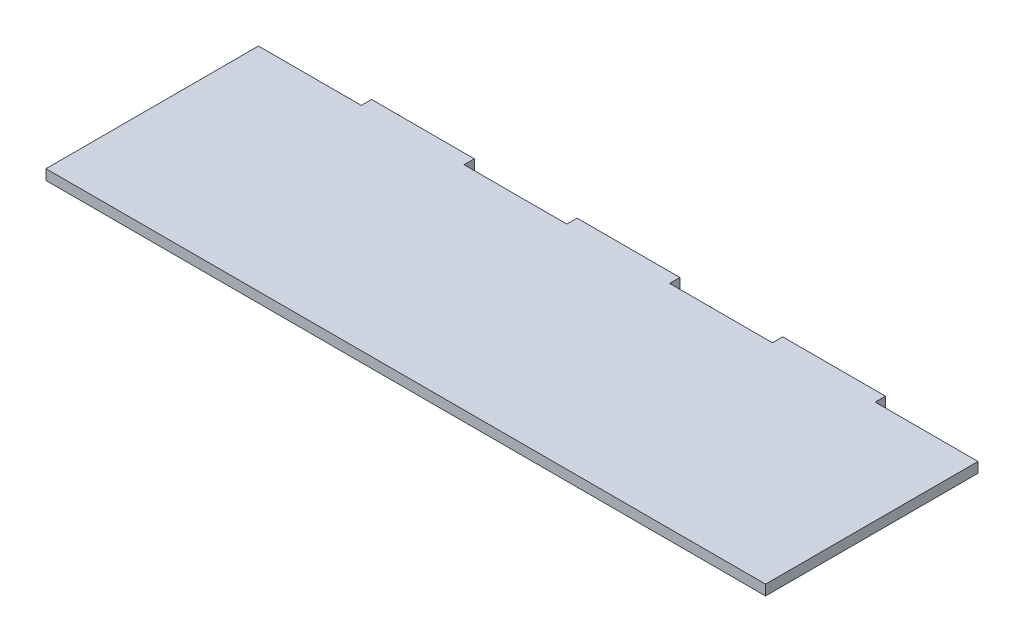
ISO-10303-21;
HEADER;
FILE_DESCRIPTION(('STEP AP214'),'2;1');
FILE_NAME('part.step','',(''),(''),'','','');
FILE_SCHEMA(('AUTOMOTIVE_DESIGN { 1 0 10303 214 1 1 1 1 }'));
ENDSEC;
DATA;
#1=APPLICATION_CONTEXT('core data for automotive mechanical design processes');
#2=APPLICATION_PROTOCOL_DEFINITION('international standard','automotive_design',2000,#1);
#3=PRODUCT_CONTEXT('',#1,'mechanical');
#4=PRODUCT('Part','Part','',(#3));
#5=PRODUCT_RELATED_PRODUCT_CATEGORY('part','',(#4));
#6=PRODUCT_DEFINITION_FORMATION('','',#4);
#7=PRODUCT_DEFINITION_CONTEXT('part definition',#1,'design');
#8=PRODUCT_DEFINITION('design','',#6,#7);
#9=PRODUCT_DEFINITION_SHAPE('','',#8);
#10=(LENGTH_UNIT() NAMED_UNIT(*) SI_UNIT(.MILLI.,.METRE.));
#11=(NAMED_UNIT(*) PLANE_ANGLE_UNIT() SI_UNIT($,.RADIAN.));
#12=(NAMED_UNIT(*) SI_UNIT($,.STERADIAN.) SOLID_ANGLE_UNIT());
#13=UNCERTAINTY_MEASURE_WITH_UNIT(LENGTH_MEASURE(1.E-05),#10,'distance_accuracy_value','');
#14=(GEOMETRIC_REPRESENTATION_CONTEXT(3) GLOBAL_UNCERTAINTY_ASSIGNED_CONTEXT((#13)) GLOBAL_UNIT_ASSIGNED_CONTEXT((#10,
#11,#12)) REPRESENTATION_CONTEXT('',''));
#15=CARTESIAN_POINT('',(0.,0.,0.));
#16=DIRECTION('',(0.,0.,1.));
#17=DIRECTION('',(1.,0.,0.));
#18=AXIS2_PLACEMENT_3D('',#15,#16,#17);
#19=CARTESIAN_POINT('',(0.,3.,-65.));
#20=DIRECTION('',(0.,0.,1.));
#21=DIRECTION('',(1.,0.,0.));
#22=AXIS2_PLACEMENT_3D('',#19,#20,#21);
#23=PLANE('',#22);
#24=DIRECTION('',(-1.,0.,0.));
#25=VECTOR('',#24,1.);
#26=CARTESIAN_POINT('',(0.,0.,-65.));
#27=LINE('',#26,#25);
#28=CARTESIAN_POINT('',(120.,0.,-65.));
#29=VERTEX_POINT('',#28);
#30=CARTESIAN_POINT('',(90.,0.,-65.));
#31=VERTEX_POINT('',#30);
#32=EDGE_CURVE('E170',#29,#31,#27,.T.);
#33=ORIENTED_EDGE('',*,*,#32,.T.);
#34=DIRECTION('',(0.,1.,0.));
#35=VECTOR('',#34,1.);
#36=CARTESIAN_POINT('',(90.,-2.,-65.));
#37=LINE('',#36,#35);
#38=CARTESIAN_POINT('',(90.,3.,-65.));
#39=VERTEX_POINT('',#38);
#40=EDGE_CURVE('E159',#31,#39,#37,.T.);
#41=ORIENTED_EDGE('',*,*,#40,.T.);
#42=DIRECTION('',(-1.,0.,0.));
#43=VECTOR('',#42,1.);
#44=CARTESIAN_POINT('',(0.,3.,-65.));
#45=LINE('',#44,#43);
#46=CARTESIAN_POINT('',(120.,3.,-65.));
#47=VERTEX_POINT('',#46);
#48=EDGE_CURVE('E181',#47,#39,#45,.T.);
#49=ORIENTED_EDGE('',*,*,#48,.F.);
#50=DIRECTION('',(0.,1.,0.));
#51=VECTOR('',#50,1.);
#52=CARTESIAN_POINT('',(120.,-2.,-65.));
#53=LINE('',#52,#51);
#54=EDGE_CURVE('E256',#29,#47,#53,.T.);
#55=ORIENTED_EDGE('',*,*,#54,.F.);
#56=EDGE_LOOP('',(#33,#41,#49,#55));
#57=FACE_BOUND('',#56,.T.);
#58=ADVANCED_FACE('F33',(#57),#23,.F.);
#59=CARTESIAN_POINT('',(180.,0.,-65.));
#60=VERTEX_POINT('',#59);
#61=CARTESIAN_POINT('',(150.,0.,-65.));
#62=VERTEX_POINT('',#61);
#63=EDGE_CURVE('E165',#60,#62,#27,.T.);
#64=ORIENTED_EDGE('',*,*,#63,.T.);
#65=DIRECTION('',(0.,1.,0.));
#66=VECTOR('',#65,1.);
#67=CARTESIAN_POINT('',(150.,-2.,-65.));
#68=LINE('',#67,#66);
#69=CARTESIAN_POINT('',(150.,3.,-65.));
#70=VERTEX_POINT('',#69);
#71=EDGE_CURVE('E257',#62,#70,#68,.T.);
#72=ORIENTED_EDGE('',*,*,#71,.T.);
#73=CARTESIAN_POINT('',(180.,3.,-65.));
#74=VERTEX_POINT('',#73);
#75=EDGE_CURVE('E182',#74,#70,#45,.T.);
#76=ORIENTED_EDGE('',*,*,#75,.F.);
#77=DIRECTION('',(0.,1.,0.));
#78=VECTOR('',#77,1.);
#79=CARTESIAN_POINT('',(180.,-2.,-65.));
#80=LINE('',#79,#78);
#81=EDGE_CURVE('E174',#60,#74,#80,.T.);
#82=ORIENTED_EDGE('',*,*,#81,.F.);
#83=EDGE_LOOP('',(#64,#72,#76,#82));
#84=FACE_BOUND('',#83,.T.);
#85=ADVANCED_FACE('F285',(#84),#23,.F.);
#86=CARTESIAN_POINT('',(0.,3.,0.));
#87=DIRECTION('',(1.,0.,0.));
#88=DIRECTION('',(0.,0.,-1.));
#89=AXIS2_PLACEMENT_3D('',#86,#87,#88);
#90=PLANE('',#89);
#91=DIRECTION('',(0.,0.,1.));
#92=VECTOR('',#91,1.);
#93=CARTESIAN_POINT('',(0.,3.,0.));
#94=LINE('',#93,#92);
#95=CARTESIAN_POINT('',(0.,3.,-62.));
#96=VERTEX_POINT('',#95);
#97=CARTESIAN_POINT('',(0.,3.,0.));
#98=VERTEX_POINT('',#97);
#99=EDGE_CURVE('E157',#96,#98,#94,.T.);
#100=ORIENTED_EDGE('',*,*,#99,.F.);
#101=DIRECTION('',(0.,1.,0.));
#102=VECTOR('',#101,1.);
#103=CARTESIAN_POINT('',(0.,-2.,-62.));
#104=LINE('',#103,#102);
#105=CARTESIAN_POINT('',(0.,0.,-62.));
#106=VERTEX_POINT('',#105);
#107=EDGE_CURVE('E143',#106,#96,#104,.T.);
#108=ORIENTED_EDGE('',*,*,#107,.F.);
#109=DIRECTION('',(0.,0.,1.));
#110=VECTOR('',#109,1.);
#111=CARTESIAN_POINT('',(0.,0.,0.));
#112=LINE('',#111,#110);
#113=CARTESIAN_POINT('',(0.,0.,0.));
#114=VERTEX_POINT('',#113);
#115=EDGE_CURVE('E183',#106,#114,#112,.T.);
#116=ORIENTED_EDGE('',*,*,#115,.T.);
#117=DIRECTION('',(0.,-1.,0.));
#118=VECTOR('',#117,1.);
#119=CARTESIAN_POINT('',(0.,3.,0.));
#120=LINE('',#119,#118);
#121=EDGE_CURVE('E163',#98,#114,#120,.T.);
#122=ORIENTED_EDGE('',*,*,#121,.F.);
#123=EDGE_LOOP('',(#100,#108,#116,#122));
#124=FACE_BOUND('',#123,.T.);
#125=ADVANCED_FACE('F35',(#124),#90,.F.);
#126=CARTESIAN_POINT('',(0.,3.,0.));
#127=DIRECTION('',(0.,0.,-1.));
#128=DIRECTION('',(-1.,0.,0.));
#129=AXIS2_PLACEMENT_3D('',#126,#127,#128);
#130=PLANE('',#129);
#131=DIRECTION('',(1.,0.,0.));
#132=VECTOR('',#131,1.);
#133=CARTESIAN_POINT('',(0.,0.,0.));
#134=LINE('',#133,#132);
#135=CARTESIAN_POINT('',(210.,0.,0.));
#136=VERTEX_POINT('',#135);
#137=EDGE_CURVE('E185',#114,#136,#134,.T.);
#138=ORIENTED_EDGE('',*,*,#137,.T.);
#139=DIRECTION('',(0.,-1.,0.));
#140=VECTOR('',#139,1.);
#141=CARTESIAN_POINT('',(210.,3.,0.));
#142=LINE('',#141,#140);
#143=CARTESIAN_POINT('',(210.,3.,0.));
#144=VERTEX_POINT('',#143);
#145=EDGE_CURVE('E192',#144,#136,#142,.T.);
#146=ORIENTED_EDGE('',*,*,#145,.F.);
#147=DIRECTION('',(1.,0.,0.));
#148=VECTOR('',#147,1.);
#149=CARTESIAN_POINT('',(0.,3.,0.));
#150=LINE('',#149,#148);
#151=EDGE_CURVE('E164',#98,#144,#150,.T.);
#152=ORIENTED_EDGE('',*,*,#151,.F.);
#153=ORIENTED_EDGE('',*,*,#121,.T.);
#154=EDGE_LOOP('',(#138,#146,#152,#153));
#155=FACE_BOUND('',#154,.T.);
#156=ADVANCED_FACE('F305',(#155),#130,.F.);
#157=CARTESIAN_POINT('',(210.,3.,0.));
#158=DIRECTION('',(-1.,0.,0.));
#159=DIRECTION('',(0.,0.,1.));
#160=AXIS2_PLACEMENT_3D('',#157,#158,#159);
#161=PLANE('',#160);
#162=DIRECTION('',(0.,0.,-1.));
#163=VECTOR('',#162,1.);
#164=CARTESIAN_POINT('',(210.,0.,0.));
#165=LINE('',#164,#163);
#166=CARTESIAN_POINT('',(210.,0.,-62.));
#167=VERTEX_POINT('',#166);
#168=EDGE_CURVE('E188',#136,#167,#165,.T.);
#169=ORIENTED_EDGE('',*,*,#168,.T.);
#170=DIRECTION('',(0.,1.,0.));
#171=VECTOR('',#170,1.);
#172=CARTESIAN_POINT('',(210.,-2.,-62.));
#173=LINE('',#172,#171);
#174=CARTESIAN_POINT('',(210.,3.,-62.));
#175=VERTEX_POINT('',#174);
#176=EDGE_CURVE('E251',#167,#175,#173,.T.);
#177=ORIENTED_EDGE('',*,*,#176,.T.);
#178=DIRECTION('',(0.,0.,-1.));
#179=VECTOR('',#178,1.);
#180=CARTESIAN_POINT('',(210.,3.,0.));
#181=LINE('',#180,#179);
#182=EDGE_CURVE('E167',#144,#175,#181,.T.);
#183=ORIENTED_EDGE('',*,*,#182,.F.);
#184=ORIENTED_EDGE('',*,*,#145,.T.);
#185=EDGE_LOOP('',(#169,#177,#183,#184));
#186=FACE_BOUND('',#185,.T.);
#187=ADVANCED_FACE('F308',(#186),#161,.F.);
#188=CARTESIAN_POINT('',(60.,0.,-65.));
#189=VERTEX_POINT('',#188);
#190=CARTESIAN_POINT('',(30.,0.,-65.));
#191=VERTEX_POINT('',#190);
#192=EDGE_CURVE('E172',#189,#191,#27,.T.);
#193=ORIENTED_EDGE('',*,*,#192,.T.);
#194=DIRECTION('',(0.,1.,0.));
#195=VECTOR('',#194,1.);
#196=CARTESIAN_POINT('',(30.,-2.,-65.));
#197=LINE('',#196,#195);
#198=CARTESIAN_POINT('',(30.,3.,-65.));
#199=VERTEX_POINT('',#198);
#200=EDGE_CURVE('E186',#191,#199,#197,.T.);
#201=ORIENTED_EDGE('',*,*,#200,.T.);
#202=CARTESIAN_POINT('',(60.,3.,-65.));
#203=VERTEX_POINT('',#202);
#204=EDGE_CURVE('E179',#203,#199,#45,.T.);
#205=ORIENTED_EDGE('',*,*,#204,.F.);
#206=DIRECTION('',(0.,1.,0.));
#207=VECTOR('',#206,1.);
#208=CARTESIAN_POINT('',(60.,-2.,-65.));
#209=LINE('',#208,#207);
#210=EDGE_CURVE('E236',#189,#203,#209,.T.);
#211=ORIENTED_EDGE('',*,*,#210,.F.);
#212=EDGE_LOOP('',(#193,#201,#205,#211));
#213=FACE_BOUND('',#212,.T.);
#214=ADVANCED_FACE('F240',(#213),#23,.F.);
#215=CARTESIAN_POINT('',(0.,3.,0.));
#216=DIRECTION('',(0.,-1.,0.));
#217=DIRECTION('',(0.,0.,-1.));
#218=AXIS2_PLACEMENT_3D('',#215,#216,#217);
#219=PLANE('',#218);
#220=ORIENTED_EDGE('',*,*,#204,.T.);
#221=DIRECTION('',(0.,0.,-1.));
#222=VECTOR('',#221,1.);
#223=CARTESIAN_POINT('',(30.,3.,-65.));
#224=LINE('',#223,#222);
#225=CARTESIAN_POINT('',(30.,3.,-62.));
#226=VERTEX_POINT('',#225);
#227=EDGE_CURVE('E152',#226,#199,#224,.T.);
#228=ORIENTED_EDGE('',*,*,#227,.F.);
#229=DIRECTION('',(1.,0.,0.));
#230=VECTOR('',#229,1.);
#231=CARTESIAN_POINT('',(0.,3.,-62.));
#232=LINE('',#231,#230);
#233=EDGE_CURVE('E146',#96,#226,#232,.T.);
#234=ORIENTED_EDGE('',*,*,#233,.F.);
#235=ORIENTED_EDGE('',*,*,#99,.T.);
#236=ORIENTED_EDGE('',*,*,#151,.T.);
#237=ORIENTED_EDGE('',*,*,#182,.T.);
#238=DIRECTION('',(1.,0.,0.));
#239=VECTOR('',#238,1.);
#240=CARTESIAN_POINT('',(180.,3.,-62.));
#241=LINE('',#240,#239);
#242=CARTESIAN_POINT('',(180.,3.,-62.));
#243=VERTEX_POINT('',#242);
#244=EDGE_CURVE('E269',#243,#175,#241,.T.);
#245=ORIENTED_EDGE('',*,*,#244,.F.);
#246=DIRECTION('',(0.,0.,1.));
#247=VECTOR('',#246,1.);
#248=CARTESIAN_POINT('',(180.,3.,-65.));
#249=LINE('',#248,#247);
#250=EDGE_CURVE('E266',#74,#243,#249,.T.);
#251=ORIENTED_EDGE('',*,*,#250,.F.);
#252=ORIENTED_EDGE('',*,*,#75,.T.);
#253=DIRECTION('',(0.,0.,-1.));
#254=VECTOR('',#253,1.);
#255=CARTESIAN_POINT('',(150.,3.,-65.));
#256=LINE('',#255,#254);
#257=CARTESIAN_POINT('',(150.,3.,-62.));
#258=VERTEX_POINT('',#257);
#259=EDGE_CURVE('E254',#258,#70,#256,.T.);
#260=ORIENTED_EDGE('',*,*,#259,.F.);
#261=DIRECTION('',(1.,0.,0.));
#262=VECTOR('',#261,1.);
#263=CARTESIAN_POINT('',(120.,3.,-62.));
#264=LINE('',#263,#262);
#265=CARTESIAN_POINT('',(120.,3.,-62.));
#266=VERTEX_POINT('',#265);
#267=EDGE_CURVE('E250',#266,#258,#264,.T.);
#268=ORIENTED_EDGE('',*,*,#267,.F.);
#269=DIRECTION('',(0.,0.,1.));
#270=VECTOR('',#269,1.);
#271=CARTESIAN_POINT('',(120.,3.,-65.));
#272=LINE('',#271,#270);
#273=EDGE_CURVE('E247',#47,#266,#272,.T.);
#274=ORIENTED_EDGE('',*,*,#273,.F.);
#275=ORIENTED_EDGE('',*,*,#48,.T.);
#276=DIRECTION('',(0.,0.,-1.));
#277=VECTOR('',#276,1.);
#278=CARTESIAN_POINT('',(90.,3.,-65.));
#279=LINE('',#278,#277);
#280=CARTESIAN_POINT('',(90.,3.,-62.));
#281=VERTEX_POINT('',#280);
#282=EDGE_CURVE('E242',#281,#39,#279,.T.);
#283=ORIENTED_EDGE('',*,*,#282,.F.);
#284=DIRECTION('',(1.,0.,0.));
#285=VECTOR('',#284,1.);
#286=CARTESIAN_POINT('',(60.,3.,-62.));
#287=LINE('',#286,#285);
#288=CARTESIAN_POINT('',(60.,3.,-62.));
#289=VERTEX_POINT('',#288);
#290=EDGE_CURVE('E228',#289,#281,#287,.T.);
#291=ORIENTED_EDGE('',*,*,#290,.F.);
#292=DIRECTION('',(0.,0.,1.));
#293=VECTOR('',#292,1.);
#294=CARTESIAN_POINT('',(60.,3.,-65.));
#295=LINE('',#294,#293);
#296=EDGE_CURVE('E260',#203,#289,#295,.T.);
#297=ORIENTED_EDGE('',*,*,#296,.F.);
#298=EDGE_LOOP('',(#220,#228,#234,#235,#236,#237,#245,#251,#252,#260,#268,#274,#275,#283,#291,#297));
#299=FACE_BOUND('',#298,.T.);
#300=ADVANCED_FACE('F156',(#299),#219,.F.);
#301=CARTESIAN_POINT('',(0.,0.,0.));
#302=DIRECTION('',(0.,-1.,0.));
#303=DIRECTION('',(0.,0.,-1.));
#304=AXIS2_PLACEMENT_3D('',#301,#302,#303);
#305=PLANE('',#304);
#306=DIRECTION('',(0.,0.,1.));
#307=VECTOR('',#306,1.);
#308=CARTESIAN_POINT('',(30.,0.,0.));
#309=LINE('',#308,#307);
#310=CARTESIAN_POINT('',(30.,0.,-62.));
#311=VERTEX_POINT('',#310);
#312=EDGE_CURVE('E11',#191,#311,#309,.T.);
#313=ORIENTED_EDGE('',*,*,#312,.F.);
#314=ORIENTED_EDGE('',*,*,#192,.F.);
#315=DIRECTION('',(0.,0.,-1.));
#316=VECTOR('',#315,1.);
#317=CARTESIAN_POINT('',(60.,0.,0.));
#318=LINE('',#317,#316);
#319=CARTESIAN_POINT('',(60.,0.,-62.));
#320=VERTEX_POINT('',#319);
#321=EDGE_CURVE('E208',#320,#189,#318,.T.);
#322=ORIENTED_EDGE('',*,*,#321,.F.);
#323=DIRECTION('',(-1.,0.,0.));
#324=VECTOR('',#323,1.);
#325=CARTESIAN_POINT('',(0.,0.,-62.));
#326=LINE('',#325,#324);
#327=CARTESIAN_POINT('',(90.,0.,-62.));
#328=VERTEX_POINT('',#327);
#329=EDGE_CURVE('E210',#328,#320,#326,.T.);
#330=ORIENTED_EDGE('',*,*,#329,.F.);
#331=DIRECTION('',(0.,0.,1.));
#332=VECTOR('',#331,1.);
#333=CARTESIAN_POINT('',(90.,0.,0.));
#334=LINE('',#333,#332);
#335=EDGE_CURVE('E212',#31,#328,#334,.T.);
#336=ORIENTED_EDGE('',*,*,#335,.F.);
#337=ORIENTED_EDGE('',*,*,#32,.F.);
#338=DIRECTION('',(0.,0.,-1.));
#339=VECTOR('',#338,1.);
#340=CARTESIAN_POINT('',(120.,0.,0.));
#341=LINE('',#340,#339);
#342=CARTESIAN_POINT('',(120.,0.,-62.));
#343=VERTEX_POINT('',#342);
#344=EDGE_CURVE('E201',#343,#29,#341,.T.);
#345=ORIENTED_EDGE('',*,*,#344,.F.);
#346=DIRECTION('',(-1.,0.,0.));
#347=VECTOR('',#346,1.);
#348=CARTESIAN_POINT('',(0.,0.,-62.));
#349=LINE('',#348,#347);
#350=CARTESIAN_POINT('',(150.,0.,-62.));
#351=VERTEX_POINT('',#350);
#352=EDGE_CURVE('E203',#351,#343,#349,.T.);
#353=ORIENTED_EDGE('',*,*,#352,.F.);
#354=DIRECTION('',(0.,0.,1.));
#355=VECTOR('',#354,1.);
#356=CARTESIAN_POINT('',(150.,0.,0.));
#357=LINE('',#356,#355);
#358=EDGE_CURVE('E206',#62,#351,#357,.T.);
#359=ORIENTED_EDGE('',*,*,#358,.F.);
#360=ORIENTED_EDGE('',*,*,#63,.F.);
#361=DIRECTION('',(0.,0.,-1.));
#362=VECTOR('',#361,1.);
#363=CARTESIAN_POINT('',(180.,0.,0.));
#364=LINE('',#363,#362);
#365=CARTESIAN_POINT('',(180.,0.,-62.));
#366=VERTEX_POINT('',#365);
#367=EDGE_CURVE('E196',#366,#60,#364,.T.);
#368=ORIENTED_EDGE('',*,*,#367,.F.);
#369=DIRECTION('',(-1.,0.,0.));
#370=VECTOR('',#369,1.);
#371=CARTESIAN_POINT('',(0.,0.,-62.));
#372=LINE('',#371,#370);
#373=EDGE_CURVE('E198',#167,#366,#372,.T.);
#374=ORIENTED_EDGE('',*,*,#373,.F.);
#375=ORIENTED_EDGE('',*,*,#168,.F.);
#376=ORIENTED_EDGE('',*,*,#137,.F.);
#377=ORIENTED_EDGE('',*,*,#115,.F.);
#378=DIRECTION('',(-1.,0.,0.));
#379=VECTOR('',#378,1.);
#380=CARTESIAN_POINT('',(0.,0.,-62.));
#381=LINE('',#380,#379);
#382=EDGE_CURVE('E41',#311,#106,#381,.T.);
#383=ORIENTED_EDGE('',*,*,#382,.F.);
#384=EDGE_LOOP('',(#313,#314,#322,#330,#336,#337,#345,#353,#359,#360,#368,#374,#375,#376,#377,#383));
#385=FACE_BOUND('',#384,.T.);
#386=ADVANCED_FACE('F232',(#385),#305,.T.);
#387=CARTESIAN_POINT('',(180.,-2.,-62.));
#388=DIRECTION('',(0.,0.,1.));
#389=DIRECTION('',(1.,0.,0.));
#390=AXIS2_PLACEMENT_3D('',#387,#388,#389);
#391=PLANE('',#390);
#392=ORIENTED_EDGE('',*,*,#373,.T.);
#393=DIRECTION('',(0.,1.,0.));
#394=VECTOR('',#393,1.);
#395=CARTESIAN_POINT('',(180.,-2.,-62.));
#396=LINE('',#395,#394);
#397=EDGE_CURVE('E272',#366,#243,#396,.T.);
#398=ORIENTED_EDGE('',*,*,#397,.T.);
#399=ORIENTED_EDGE('',*,*,#244,.T.);
#400=ORIENTED_EDGE('',*,*,#176,.F.);
#401=EDGE_LOOP('',(#392,#398,#399,#400));
#402=FACE_BOUND('',#401,.T.);
#403=ADVANCED_FACE('F309',(#402),#391,.F.);
#404=CARTESIAN_POINT('',(180.,-2.,-65.));
#405=DIRECTION('',(-1.,0.,0.));
#406=DIRECTION('',(0.,0.,1.));
#407=AXIS2_PLACEMENT_3D('',#404,#405,#406);
#408=PLANE('',#407);
#409=ORIENTED_EDGE('',*,*,#367,.T.);
#410=ORIENTED_EDGE('',*,*,#81,.T.);
#411=ORIENTED_EDGE('',*,*,#250,.T.);
#412=ORIENTED_EDGE('',*,*,#397,.F.);
#413=EDGE_LOOP('',(#409,#410,#411,#412));
#414=FACE_BOUND('',#413,.T.);
#415=ADVANCED_FACE('F277',(#414),#408,.F.);
#416=CARTESIAN_POINT('',(150.,-2.,-65.));
#417=DIRECTION('',(1.,0.,0.));
#418=DIRECTION('',(0.,0.,-1.));
#419=AXIS2_PLACEMENT_3D('',#416,#417,#418);
#420=PLANE('',#419);
#421=ORIENTED_EDGE('',*,*,#358,.T.);
#422=DIRECTION('',(0.,1.,0.));
#423=VECTOR('',#422,1.);
#424=CARTESIAN_POINT('',(150.,-2.,-62.));
#425=LINE('',#424,#423);
#426=EDGE_CURVE('E261',#351,#258,#425,.T.);
#427=ORIENTED_EDGE('',*,*,#426,.T.);
#428=ORIENTED_EDGE('',*,*,#259,.T.);
#429=ORIENTED_EDGE('',*,*,#71,.F.);
#430=EDGE_LOOP('',(#421,#427,#428,#429));
#431=FACE_BOUND('',#430,.T.);
#432=ADVANCED_FACE('F315',(#431),#420,.F.);
#433=CARTESIAN_POINT('',(120.,-2.,-62.));
#434=DIRECTION('',(0.,0.,1.));
#435=DIRECTION('',(1.,0.,0.));
#436=AXIS2_PLACEMENT_3D('',#433,#434,#435);
#437=PLANE('',#436);
#438=ORIENTED_EDGE('',*,*,#352,.T.);
#439=DIRECTION('',(0.,1.,0.));
#440=VECTOR('',#439,1.);
#441=CARTESIAN_POINT('',(120.,-2.,-62.));
#442=LINE('',#441,#440);
#443=EDGE_CURVE('E263',#343,#266,#442,.T.);
#444=ORIENTED_EDGE('',*,*,#443,.T.);
#445=ORIENTED_EDGE('',*,*,#267,.T.);
#446=ORIENTED_EDGE('',*,*,#426,.F.);
#447=EDGE_LOOP('',(#438,#444,#445,#446));
#448=FACE_BOUND('',#447,.T.);
#449=ADVANCED_FACE('F317',(#448),#437,.F.);
#450=CARTESIAN_POINT('',(120.,-2.,-65.));
#451=DIRECTION('',(-1.,0.,0.));
#452=DIRECTION('',(0.,0.,1.));
#453=AXIS2_PLACEMENT_3D('',#450,#451,#452);
#454=PLANE('',#453);
#455=ORIENTED_EDGE('',*,*,#344,.T.);
#456=ORIENTED_EDGE('',*,*,#54,.T.);
#457=ORIENTED_EDGE('',*,*,#273,.T.);
#458=ORIENTED_EDGE('',*,*,#443,.F.);
#459=EDGE_LOOP('',(#455,#456,#457,#458));
#460=FACE_BOUND('',#459,.T.);
#461=ADVANCED_FACE('F319',(#460),#454,.F.);
#462=CARTESIAN_POINT('',(90.,-2.,-65.));
#463=DIRECTION('',(1.,0.,0.));
#464=DIRECTION('',(0.,0.,-1.));
#465=AXIS2_PLACEMENT_3D('',#462,#463,#464);
#466=PLANE('',#465);
#467=ORIENTED_EDGE('',*,*,#335,.T.);
#468=DIRECTION('',(0.,1.,0.));
#469=VECTOR('',#468,1.);
#470=CARTESIAN_POINT('',(90.,-2.,-62.));
#471=LINE('',#470,#469);
#472=EDGE_CURVE('E217',#328,#281,#471,.T.);
#473=ORIENTED_EDGE('',*,*,#472,.T.);
#474=ORIENTED_EDGE('',*,*,#282,.T.);
#475=ORIENTED_EDGE('',*,*,#40,.F.);
#476=EDGE_LOOP('',(#467,#473,#474,#475));
#477=FACE_BOUND('',#476,.T.);
#478=ADVANCED_FACE('F216',(#477),#466,.F.);
#479=CARTESIAN_POINT('',(60.,-2.,-62.));
#480=DIRECTION('',(0.,0.,1.));
#481=DIRECTION('',(1.,0.,0.));
#482=AXIS2_PLACEMENT_3D('',#479,#480,#481);
#483=PLANE('',#482);
#484=ORIENTED_EDGE('',*,*,#329,.T.);
#485=DIRECTION('',(0.,1.,0.));
#486=VECTOR('',#485,1.);
#487=CARTESIAN_POINT('',(60.,-2.,-62.));
#488=LINE('',#487,#486);
#489=EDGE_CURVE('E55',#320,#289,#488,.T.);
#490=ORIENTED_EDGE('',*,*,#489,.T.);
#491=ORIENTED_EDGE('',*,*,#290,.T.);
#492=ORIENTED_EDGE('',*,*,#472,.F.);
#493=EDGE_LOOP('',(#484,#490,#491,#492));
#494=FACE_BOUND('',#493,.T.);
#495=ADVANCED_FACE('F225',(#494),#483,.F.);
#496=CARTESIAN_POINT('',(60.,-2.,-65.));
#497=DIRECTION('',(-1.,0.,0.));
#498=DIRECTION('',(0.,0.,1.));
#499=AXIS2_PLACEMENT_3D('',#496,#497,#498);
#500=PLANE('',#499);
#501=ORIENTED_EDGE('',*,*,#321,.T.);
#502=ORIENTED_EDGE('',*,*,#210,.T.);
#503=ORIENTED_EDGE('',*,*,#296,.T.);
#504=ORIENTED_EDGE('',*,*,#489,.F.);
#505=EDGE_LOOP('',(#501,#502,#503,#504));
#506=FACE_BOUND('',#505,.T.);
#507=ADVANCED_FACE('F235',(#506),#500,.F.);
#508=CARTESIAN_POINT('',(30.,-2.,-65.));
#509=DIRECTION('',(1.,0.,0.));
#510=DIRECTION('',(0.,0.,-1.));
#511=AXIS2_PLACEMENT_3D('',#508,#509,#510);
#512=PLANE('',#511);
#513=ORIENTED_EDGE('',*,*,#312,.T.);
#514=DIRECTION('',(0.,1.,0.));
#515=VECTOR('',#514,1.);
#516=CARTESIAN_POINT('',(30.,-2.,-62.));
#517=LINE('',#516,#515);
#518=EDGE_CURVE('E48',#311,#226,#517,.T.);
#519=ORIENTED_EDGE('',*,*,#518,.T.);
#520=ORIENTED_EDGE('',*,*,#227,.T.);
#521=ORIENTED_EDGE('',*,*,#200,.F.);
#522=EDGE_LOOP('',(#513,#519,#520,#521));
#523=FACE_BOUND('',#522,.T.);
#524=ADVANCED_FACE('F299',(#523),#512,.F.);
#525=CARTESIAN_POINT('',(0.,-2.,-62.));
#526=DIRECTION('',(0.,0.,1.));
#527=DIRECTION('',(1.,0.,0.));
#528=AXIS2_PLACEMENT_3D('',#525,#526,#527);
#529=PLANE('',#528);
#530=ORIENTED_EDGE('',*,*,#382,.T.);
#531=ORIENTED_EDGE('',*,*,#107,.T.);
#532=ORIENTED_EDGE('',*,*,#233,.T.);
#533=ORIENTED_EDGE('',*,*,#518,.F.);
#534=EDGE_LOOP('',(#530,#531,#532,#533));
#535=FACE_BOUND('',#534,.T.);
#536=ADVANCED_FACE('F145',(#535),#529,.F.);
#537=CLOSED_SHELL('',(#58,#85,#125,#156,#187,#214,#300,#386,#403,#415,#432,#449,#461,#478,#495,
#507,#524,#536));
#538=MANIFOLD_SOLID_BREP('B2',#537);
#539=ADVANCED_BREP_SHAPE_REPRESENTATION('',(#18,#538),#14);
#540=SHAPE_DEFINITION_REPRESENTATION(#9,#539);
ENDSEC;
END-ISO-10303-21;
